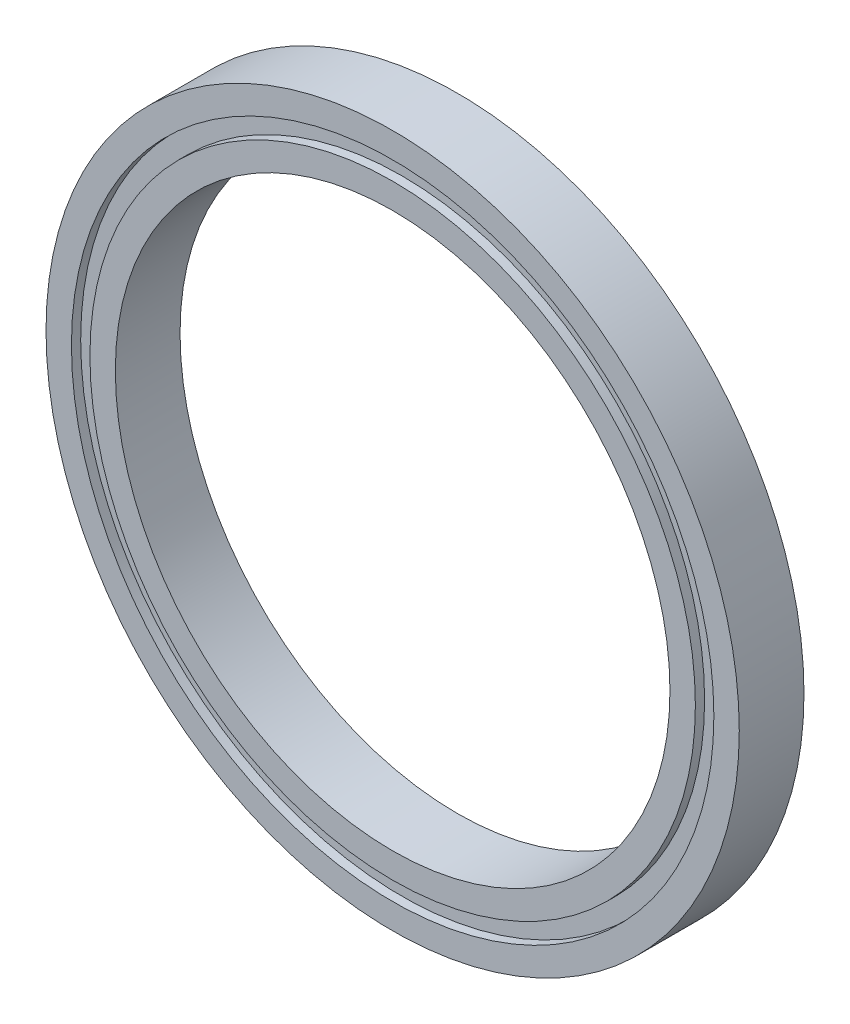
ISO-10303-21;
HEADER;
FILE_DESCRIPTION(('STEP AP214'),'2;1');
FILE_NAME('part.step','',(''),(''),'','','');
FILE_SCHEMA(('AUTOMOTIVE_DESIGN { 1 0 10303 214 1 1 1 1 }'));
ENDSEC;
DATA;
#1=APPLICATION_CONTEXT('core data for automotive mechanical design processes');
#2=APPLICATION_PROTOCOL_DEFINITION('international standard','automotive_design',2000,#1);
#3=PRODUCT_CONTEXT('',#1,'mechanical');
#4=PRODUCT('Part','Part','',(#3));
#5=PRODUCT_RELATED_PRODUCT_CATEGORY('part','',(#4));
#6=PRODUCT_DEFINITION_FORMATION('','',#4);
#7=PRODUCT_DEFINITION_CONTEXT('part definition',#1,'design');
#8=PRODUCT_DEFINITION('design','',#6,#7);
#9=PRODUCT_DEFINITION_SHAPE('','',#8);
#10=(LENGTH_UNIT() NAMED_UNIT(*) SI_UNIT(.MILLI.,.METRE.));
#11=(NAMED_UNIT(*) PLANE_ANGLE_UNIT() SI_UNIT($,.RADIAN.));
#12=(NAMED_UNIT(*) SI_UNIT($,.STERADIAN.) SOLID_ANGLE_UNIT());
#13=UNCERTAINTY_MEASURE_WITH_UNIT(LENGTH_MEASURE(1.E-05),#10,'distance_accuracy_value','');
#14=(GEOMETRIC_REPRESENTATION_CONTEXT(3) GLOBAL_UNCERTAINTY_ASSIGNED_CONTEXT((#13)) GLOBAL_UNIT_ASSIGNED_CONTEXT((#10,
#11,#12)) REPRESENTATION_CONTEXT('',''));
#15=CARTESIAN_POINT('',(0.,0.,0.));
#16=DIRECTION('',(0.,0.,1.));
#17=DIRECTION('',(1.,0.,0.));
#18=AXIS2_PLACEMENT_3D('',#15,#16,#17);
#19=CARTESIAN_POINT('',(0.,37.5,-3.5));
#20=DIRECTION('',(0.,0.,-1.));
#21=DIRECTION('',(-1.,0.,0.));
#22=AXIS2_PLACEMENT_3D('',#19,#20,#21);
#23=PLANE('',#22);
#24=CARTESIAN_POINT('',(0.,0.,-3.5));
#25=DIRECTION('',(0.,0.,-1.));
#26=DIRECTION('',(-1.,0.,0.));
#27=AXIS2_PLACEMENT_3D('',#24,#25,#26);
#28=CIRCLE('',#27,37.5);
#29=CARTESIAN_POINT('',(-37.5,0.,-3.5));
#30=VERTEX_POINT('',#29);
#31=EDGE_CURVE('E85',#30,#30,#28,.T.);
#32=ORIENTED_EDGE('',*,*,#31,.T.);
#33=EDGE_LOOP('',(#32));
#34=FACE_BOUND('',#33,.T.);
#35=CARTESIAN_POINT('',(0.,0.,-3.5));
#36=DIRECTION('',(0.,0.,-1.));
#37=DIRECTION('',(-1.,0.,0.));
#38=AXIS2_PLACEMENT_3D('',#35,#36,#37);
#39=CIRCLE('',#38,34.75);
#40=CARTESIAN_POINT('',(-34.75,0.,-3.5));
#41=VERTEX_POINT('',#40);
#42=EDGE_CURVE('E10',#41,#41,#39,.T.);
#43=ORIENTED_EDGE('',*,*,#42,.F.);
#44=EDGE_LOOP('',(#43));
#45=FACE_BOUND('',#44,.T.);
#46=ADVANCED_FACE('F45',(#34,#45),#23,.T.);
#47=CARTESIAN_POINT('',(0.,0.,0.));
#48=DIRECTION('',(0.,0.,-1.));
#49=DIRECTION('',(-1.,0.,0.));
#50=AXIS2_PLACEMENT_3D('',#47,#48,#49);
#51=CYLINDRICAL_SURFACE('',#50,34.75);
#52=ORIENTED_EDGE('',*,*,#42,.T.);
#53=EDGE_LOOP('',(#52));
#54=FACE_BOUND('',#53,.T.);
#55=CARTESIAN_POINT('',(0.,0.,-2.5));
#56=DIRECTION('',(0.,0.,-1.));
#57=DIRECTION('',(-1.,0.,0.));
#58=AXIS2_PLACEMENT_3D('',#55,#56,#57);
#59=CIRCLE('',#58,34.75);
#60=CARTESIAN_POINT('',(-34.75,0.,-2.5));
#61=VERTEX_POINT('',#60);
#62=EDGE_CURVE('E51',#61,#61,#59,.T.);
#63=ORIENTED_EDGE('',*,*,#62,.F.);
#64=EDGE_LOOP('',(#63));
#65=FACE_BOUND('',#64,.T.);
#66=ADVANCED_FACE('F103',(#54,#65),#51,.F.);
#67=CARTESIAN_POINT('',(0.,34.75,-2.5));
#68=DIRECTION('',(0.,0.,-1.));
#69=DIRECTION('',(-1.,0.,0.));
#70=AXIS2_PLACEMENT_3D('',#67,#68,#69);
#71=PLANE('',#70);
#72=ORIENTED_EDGE('',*,*,#62,.T.);
#73=EDGE_LOOP('',(#72));
#74=FACE_BOUND('',#73,.T.);
#75=CARTESIAN_POINT('',(0.,0.,-2.5));
#76=DIRECTION('',(0.,0.,-1.));
#77=DIRECTION('',(-1.,0.,0.));
#78=AXIS2_PLACEMENT_3D('',#75,#76,#77);
#79=CIRCLE('',#78,32.75);
#80=CARTESIAN_POINT('',(-32.75,0.,-2.5));
#81=VERTEX_POINT('',#80);
#82=EDGE_CURVE('E55',#81,#81,#79,.T.);
#83=ORIENTED_EDGE('',*,*,#82,.F.);
#84=EDGE_LOOP('',(#83));
#85=FACE_BOUND('',#84,.T.);
#86=ADVANCED_FACE('F107',(#74,#85),#71,.T.);
#87=CARTESIAN_POINT('',(0.,0.,0.));
#88=DIRECTION('',(0.,0.,-1.));
#89=DIRECTION('',(-1.,0.,0.));
#90=AXIS2_PLACEMENT_3D('',#87,#88,#89);
#91=CYLINDRICAL_SURFACE('',#90,32.75);
#92=ORIENTED_EDGE('',*,*,#82,.T.);
#93=EDGE_LOOP('',(#92));
#94=FACE_BOUND('',#93,.T.);
#95=CARTESIAN_POINT('',(0.,0.,-3.5));
#96=DIRECTION('',(0.,0.,-1.));
#97=DIRECTION('',(-1.,0.,0.));
#98=AXIS2_PLACEMENT_3D('',#95,#96,#97);
#99=CIRCLE('',#98,32.75);
#100=CARTESIAN_POINT('',(-32.75,0.,-3.5));
#101=VERTEX_POINT('',#100);
#102=EDGE_CURVE('E59',#101,#101,#99,.T.);
#103=ORIENTED_EDGE('',*,*,#102,.F.);
#104=EDGE_LOOP('',(#103));
#105=FACE_BOUND('',#104,.T.);
#106=ADVANCED_FACE('F112',(#94,#105),#91,.T.);
#107=CARTESIAN_POINT('',(0.,30.,-3.5));
#108=DIRECTION('',(0.,0.,-1.));
#109=DIRECTION('',(-1.,0.,0.));
#110=AXIS2_PLACEMENT_3D('',#107,#108,#109);
#111=PLANE('',#110);
#112=ORIENTED_EDGE('',*,*,#102,.T.);
#113=EDGE_LOOP('',(#112));
#114=FACE_BOUND('',#113,.T.);
#115=CARTESIAN_POINT('',(0.,0.,-3.5));
#116=DIRECTION('',(0.,0.,-1.));
#117=DIRECTION('',(-1.,0.,0.));
#118=AXIS2_PLACEMENT_3D('',#115,#116,#117);
#119=CIRCLE('',#118,30.);
#120=CARTESIAN_POINT('',(-30.,0.,-3.5));
#121=VERTEX_POINT('',#120);
#122=EDGE_CURVE('E64',#121,#121,#119,.T.);
#123=ORIENTED_EDGE('',*,*,#122,.F.);
#124=EDGE_LOOP('',(#123));
#125=FACE_BOUND('',#124,.T.);
#126=ADVANCED_FACE('F118',(#114,#125),#111,.T.);
#127=CARTESIAN_POINT('',(0.,0.,0.));
#128=DIRECTION('',(0.,0.,-1.));
#129=DIRECTION('',(-1.,0.,0.));
#130=AXIS2_PLACEMENT_3D('',#127,#128,#129);
#131=CYLINDRICAL_SURFACE('',#130,30.);
#132=ORIENTED_EDGE('',*,*,#122,.T.);
#133=EDGE_LOOP('',(#132));
#134=FACE_BOUND('',#133,.T.);
#135=CARTESIAN_POINT('',(0.,0.,3.5));
#136=DIRECTION('',(0.,0.,-1.));
#137=DIRECTION('',(-1.,0.,0.));
#138=AXIS2_PLACEMENT_3D('',#135,#136,#137);
#139=CIRCLE('',#138,30.);
#140=CARTESIAN_POINT('',(-30.,0.,3.5));
#141=VERTEX_POINT('',#140);
#142=EDGE_CURVE('E67',#141,#141,#139,.T.);
#143=ORIENTED_EDGE('',*,*,#142,.F.);
#144=EDGE_LOOP('',(#143));
#145=FACE_BOUND('',#144,.T.);
#146=ADVANCED_FACE('F122',(#134,#145),#131,.F.);
#147=CARTESIAN_POINT('',(0.,30.,3.5));
#148=DIRECTION('',(0.,0.,1.));
#149=DIRECTION('',(1.,0.,0.));
#150=AXIS2_PLACEMENT_3D('',#147,#148,#149);
#151=PLANE('',#150);
#152=ORIENTED_EDGE('',*,*,#142,.T.);
#153=EDGE_LOOP('',(#152));
#154=FACE_BOUND('',#153,.T.);
#155=CARTESIAN_POINT('',(0.,0.,3.5));
#156=DIRECTION('',(0.,0.,-1.));
#157=DIRECTION('',(-1.,0.,0.));
#158=AXIS2_PLACEMENT_3D('',#155,#156,#157);
#159=CIRCLE('',#158,32.75);
#160=CARTESIAN_POINT('',(-32.75,0.,3.5));
#161=VERTEX_POINT('',#160);
#162=EDGE_CURVE('E70',#161,#161,#159,.T.);
#163=ORIENTED_EDGE('',*,*,#162,.F.);
#164=EDGE_LOOP('',(#163));
#165=FACE_BOUND('',#164,.T.);
#166=ADVANCED_FACE('F126',(#154,#165),#151,.T.);
#167=CARTESIAN_POINT('',(0.,0.,0.));
#168=DIRECTION('',(0.,0.,-1.));
#169=DIRECTION('',(-1.,0.,0.));
#170=AXIS2_PLACEMENT_3D('',#167,#168,#169);
#171=CYLINDRICAL_SURFACE('',#170,32.75);
#172=ORIENTED_EDGE('',*,*,#162,.T.);
#173=EDGE_LOOP('',(#172));
#174=FACE_BOUND('',#173,.T.);
#175=CARTESIAN_POINT('',(0.,0.,2.5));
#176=DIRECTION('',(0.,0.,-1.));
#177=DIRECTION('',(-1.,0.,0.));
#178=AXIS2_PLACEMENT_3D('',#175,#176,#177);
#179=CIRCLE('',#178,32.75);
#180=CARTESIAN_POINT('',(-32.75,0.,2.5));
#181=VERTEX_POINT('',#180);
#182=EDGE_CURVE('E73',#181,#181,#179,.T.);
#183=ORIENTED_EDGE('',*,*,#182,.F.);
#184=EDGE_LOOP('',(#183));
#185=FACE_BOUND('',#184,.T.);
#186=ADVANCED_FACE('F130',(#174,#185),#171,.T.);
#187=CARTESIAN_POINT('',(0.,34.75,2.5));
#188=DIRECTION('',(0.,0.,1.));
#189=DIRECTION('',(1.,0.,0.));
#190=AXIS2_PLACEMENT_3D('',#187,#188,#189);
#191=PLANE('',#190);
#192=ORIENTED_EDGE('',*,*,#182,.T.);
#193=EDGE_LOOP('',(#192));
#194=FACE_BOUND('',#193,.T.);
#195=CARTESIAN_POINT('',(0.,0.,2.5));
#196=DIRECTION('',(0.,0.,-1.));
#197=DIRECTION('',(-1.,0.,0.));
#198=AXIS2_PLACEMENT_3D('',#195,#196,#197);
#199=CIRCLE('',#198,34.75);
#200=CARTESIAN_POINT('',(-34.75,0.,2.5));
#201=VERTEX_POINT('',#200);
#202=EDGE_CURVE('E76',#201,#201,#199,.T.);
#203=ORIENTED_EDGE('',*,*,#202,.F.);
#204=EDGE_LOOP('',(#203));
#205=FACE_BOUND('',#204,.T.);
#206=ADVANCED_FACE('F134',(#194,#205),#191,.T.);
#207=CARTESIAN_POINT('',(0.,0.,0.));
#208=DIRECTION('',(0.,0.,-1.));
#209=DIRECTION('',(-1.,0.,0.));
#210=AXIS2_PLACEMENT_3D('',#207,#208,#209);
#211=CYLINDRICAL_SURFACE('',#210,34.75);
#212=ORIENTED_EDGE('',*,*,#202,.T.);
#213=EDGE_LOOP('',(#212));
#214=FACE_BOUND('',#213,.T.);
#215=CARTESIAN_POINT('',(0.,0.,3.5));
#216=DIRECTION('',(0.,0.,-1.));
#217=DIRECTION('',(-1.,0.,0.));
#218=AXIS2_PLACEMENT_3D('',#215,#216,#217);
#219=CIRCLE('',#218,34.75);
#220=CARTESIAN_POINT('',(-34.75,0.,3.5));
#221=VERTEX_POINT('',#220);
#222=EDGE_CURVE('E79',#221,#221,#219,.T.);
#223=ORIENTED_EDGE('',*,*,#222,.F.);
#224=EDGE_LOOP('',(#223));
#225=FACE_BOUND('',#224,.T.);
#226=ADVANCED_FACE('F99',(#214,#225),#211,.F.);
#227=CARTESIAN_POINT('',(0.,37.5,3.5));
#228=DIRECTION('',(0.,0.,1.));
#229=DIRECTION('',(1.,0.,0.));
#230=AXIS2_PLACEMENT_3D('',#227,#228,#229);
#231=PLANE('',#230);
#232=ORIENTED_EDGE('',*,*,#222,.T.);
#233=EDGE_LOOP('',(#232));
#234=FACE_BOUND('',#233,.T.);
#235=CARTESIAN_POINT('',(0.,0.,3.5));
#236=DIRECTION('',(0.,0.,-1.));
#237=DIRECTION('',(-1.,0.,0.));
#238=AXIS2_PLACEMENT_3D('',#235,#236,#237);
#239=CIRCLE('',#238,37.5);
#240=CARTESIAN_POINT('',(-37.5,0.,3.5));
#241=VERTEX_POINT('',#240);
#242=EDGE_CURVE('E82',#241,#241,#239,.T.);
#243=ORIENTED_EDGE('',*,*,#242,.F.);
#244=EDGE_LOOP('',(#243));
#245=FACE_BOUND('',#244,.T.);
#246=ADVANCED_FACE('F93',(#234,#245),#231,.T.);
#247=CARTESIAN_POINT('',(0.,0.,0.));
#248=DIRECTION('',(0.,0.,-1.));
#249=DIRECTION('',(-1.,0.,0.));
#250=AXIS2_PLACEMENT_3D('',#247,#248,#249);
#251=CYLINDRICAL_SURFACE('',#250,37.5);
#252=ORIENTED_EDGE('',*,*,#242,.T.);
#253=EDGE_LOOP('',(#252));
#254=FACE_BOUND('',#253,.T.);
#255=ORIENTED_EDGE('',*,*,#31,.F.);
#256=EDGE_LOOP('',(#255));
#257=FACE_BOUND('',#256,.T.);
#258=ADVANCED_FACE('F91',(#254,#257),#251,.T.);
#259=CLOSED_SHELL('',(#46,#66,#86,#106,#126,#146,#166,#186,#206,#226,#246,#258));
#260=MANIFOLD_SOLID_BREP('B2',#259);
#261=ADVANCED_BREP_SHAPE_REPRESENTATION('',(#18,#260),#14);
#262=SHAPE_DEFINITION_REPRESENTATION(#9,#261);
ENDSEC;
END-ISO-10303-21;
